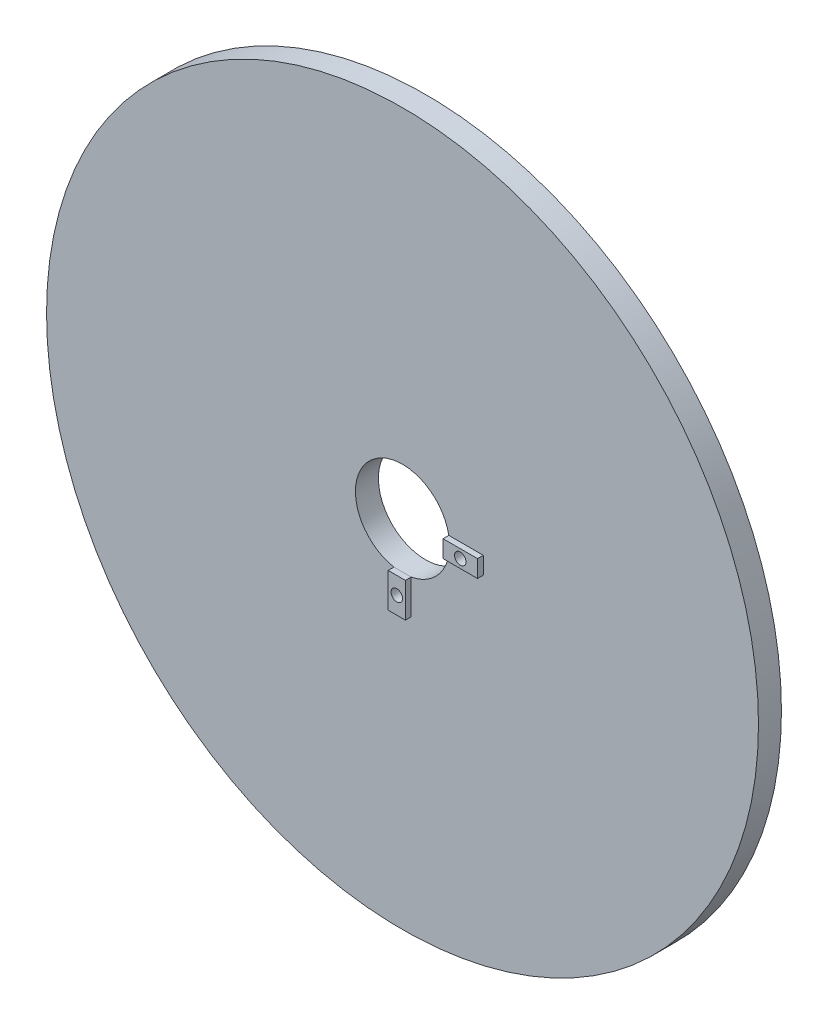
ISO-10303-21;
HEADER;
FILE_DESCRIPTION(('STEP AP214'),'2;1');
FILE_NAME('part.step','',(''),(''),'','','');
FILE_SCHEMA(('AUTOMOTIVE_DESIGN { 1 0 10303 214 1 1 1 1 }'));
ENDSEC;
DATA;
#1=APPLICATION_CONTEXT('core data for automotive mechanical design processes');
#2=APPLICATION_PROTOCOL_DEFINITION('international standard','automotive_design',2000,#1);
#3=PRODUCT_CONTEXT('',#1,'mechanical');
#4=PRODUCT('Part','Part','',(#3));
#5=PRODUCT_RELATED_PRODUCT_CATEGORY('part','',(#4));
#6=PRODUCT_DEFINITION_FORMATION('','',#4);
#7=PRODUCT_DEFINITION_CONTEXT('part definition',#1,'design');
#8=PRODUCT_DEFINITION('design','',#6,#7);
#9=PRODUCT_DEFINITION_SHAPE('','',#8);
#10=(LENGTH_UNIT() NAMED_UNIT(*) SI_UNIT(.MILLI.,.METRE.));
#11=(NAMED_UNIT(*) PLANE_ANGLE_UNIT() SI_UNIT($,.RADIAN.));
#12=(NAMED_UNIT(*) SI_UNIT($,.STERADIAN.) SOLID_ANGLE_UNIT());
#13=UNCERTAINTY_MEASURE_WITH_UNIT(LENGTH_MEASURE(1.E-05),#10,'distance_accuracy_value','');
#14=(GEOMETRIC_REPRESENTATION_CONTEXT(3) GLOBAL_UNCERTAINTY_ASSIGNED_CONTEXT((#13)) GLOBAL_UNIT_ASSIGNED_CONTEXT((#10,
#11,#12)) REPRESENTATION_CONTEXT('',''));
#15=CARTESIAN_POINT('',(0.,0.,0.));
#16=DIRECTION('',(0.,0.,1.));
#17=DIRECTION('',(1.,0.,0.));
#18=AXIS2_PLACEMENT_3D('',#15,#16,#17);
#19=CARTESIAN_POINT('',(0.,0.,3.));
#20=DIRECTION('',(0.,0.,1.));
#21=DIRECTION('',(1.,0.,0.));
#22=AXIS2_PLACEMENT_3D('',#19,#20,#21);
#23=PLANE('',#22);
#24=DIRECTION('',(1.,0.,0.));
#25=VECTOR('',#24,1.);
#26=CARTESIAN_POINT('',(-0.375,-3.51540938769273,3.));
#27=LINE('',#26,#25);
#28=CARTESIAN_POINT('',(-0.375,-3.51540938769273,3.));
#29=VERTEX_POINT('',#28);
#30=CARTESIAN_POINT('',(0.375,-3.51540938769273,3.));
#31=VERTEX_POINT('',#30);
#32=EDGE_CURVE('E189',#29,#31,#27,.T.);
#33=ORIENTED_EDGE('',*,*,#32,.F.);
#34=DIRECTION('',(0.,-1.,0.));
#35=VECTOR('',#34,1.);
#36=CARTESIAN_POINT('',(-0.375,-2.01540938769273,3.));
#37=LINE('',#36,#35);
#38=CARTESIAN_POINT('',(-0.375,-2.01540938769273,3.));
#39=VERTEX_POINT('',#38);
#40=EDGE_CURVE('E121',#39,#29,#37,.T.);
#41=ORIENTED_EDGE('',*,*,#40,.F.);
#42=CARTESIAN_POINT('',(0.,0.,3.));
#43=DIRECTION('',(0.,0.,1.));
#44=DIRECTION('',(1.,0.,0.));
#45=AXIS2_PLACEMENT_3D('',#42,#43,#44);
#46=CIRCLE('',#45,2.05);
#47=CARTESIAN_POINT('',(2.01540938769273,0.375,3.));
#48=VERTEX_POINT('',#47);
#49=EDGE_CURVE('E162',#48,#39,#46,.T.);
#50=ORIENTED_EDGE('',*,*,#49,.F.);
#51=DIRECTION('',(-1.,0.,0.));
#52=VECTOR('',#51,1.);
#53=CARTESIAN_POINT('',(2.01540938769273,0.375,3.));
#54=LINE('',#53,#52);
#55=CARTESIAN_POINT('',(3.51540938769273,0.375,3.));
#56=VERTEX_POINT('',#55);
#57=EDGE_CURVE('E54',#56,#48,#54,.T.);
#58=ORIENTED_EDGE('',*,*,#57,.F.);
#59=DIRECTION('',(0.,1.,0.));
#60=VECTOR('',#59,1.);
#61=CARTESIAN_POINT('',(3.51540938769273,-0.375,3.));
#62=LINE('',#61,#60);
#63=CARTESIAN_POINT('',(3.51540938769273,-0.375,3.));
#64=VERTEX_POINT('',#63);
#65=EDGE_CURVE('E147',#64,#56,#62,.T.);
#66=ORIENTED_EDGE('',*,*,#65,.F.);
#67=DIRECTION('',(1.,0.,0.));
#68=VECTOR('',#67,1.);
#69=CARTESIAN_POINT('',(2.01540938769273,-0.375,3.));
#70=LINE('',#69,#68);
#71=CARTESIAN_POINT('',(2.01540938769273,-0.375,3.));
#72=VERTEX_POINT('',#71);
#73=EDGE_CURVE('E144',#72,#64,#70,.T.);
#74=ORIENTED_EDGE('',*,*,#73,.F.);
#75=CARTESIAN_POINT('',(0.375,-2.01540938769273,3.));
#76=VERTEX_POINT('',#75);
#77=EDGE_CURVE('E166',#76,#72,#46,.T.);
#78=ORIENTED_EDGE('',*,*,#77,.F.);
#79=DIRECTION('',(0.,1.,0.));
#80=VECTOR('',#79,1.);
#81=CARTESIAN_POINT('',(0.375,-2.01540938769273,3.));
#82=LINE('',#81,#80);
#83=EDGE_CURVE('E184',#31,#76,#82,.T.);
#84=ORIENTED_EDGE('',*,*,#83,.F.);
#85=EDGE_LOOP('',(#33,#41,#50,#58,#66,#74,#78,#84));
#86=FACE_BOUND('',#85,.T.);
#87=CARTESIAN_POINT('',(0.,0.,3.));
#88=DIRECTION('',(0.,0.,1.));
#89=DIRECTION('',(1.,0.,0.));
#90=AXIS2_PLACEMENT_3D('',#87,#88,#89);
#91=CIRCLE('',#90,15.5);
#92=CARTESIAN_POINT('',(15.5,0.,3.));
#93=VERTEX_POINT('',#92);
#94=EDGE_CURVE('E11',#93,#93,#91,.T.);
#95=ORIENTED_EDGE('',*,*,#94,.T.);
#96=EDGE_LOOP('',(#95));
#97=FACE_BOUND('',#96,.T.);
#98=ADVANCED_FACE('F32',(#86,#97),#23,.T.);
#99=CARTESIAN_POINT('',(0.,0.,2.));
#100=DIRECTION('',(0.,0.,1.));
#101=DIRECTION('',(1.,0.,0.));
#102=AXIS2_PLACEMENT_3D('',#99,#100,#101);
#103=PLANE('',#102);
#104=CARTESIAN_POINT('',(0.,-2.76540938769273,2.));
#105=DIRECTION('',(0.,0.,1.));
#106=DIRECTION('',(1.,0.,0.));
#107=AXIS2_PLACEMENT_3D('',#104,#105,#106);
#108=CIRCLE('',#107,0.25);
#109=CARTESIAN_POINT('',(0.25,-2.76540938769273,2.));
#110=VERTEX_POINT('',#109);
#111=EDGE_CURVE('E194',#110,#110,#108,.T.);
#112=ORIENTED_EDGE('',*,*,#111,.T.);
#113=EDGE_LOOP('',(#112));
#114=FACE_BOUND('',#113,.T.);
#115=CARTESIAN_POINT('',(2.76540938769273,0.,2.));
#116=DIRECTION('',(0.,0.,1.));
#117=DIRECTION('',(1.,0.,0.));
#118=AXIS2_PLACEMENT_3D('',#115,#116,#117);
#119=CIRCLE('',#118,0.25);
#120=CARTESIAN_POINT('',(3.01540938769273,0.,2.));
#121=VERTEX_POINT('',#120);
#122=EDGE_CURVE('E232',#121,#121,#119,.T.);
#123=ORIENTED_EDGE('',*,*,#122,.T.);
#124=EDGE_LOOP('',(#123));
#125=FACE_BOUND('',#124,.T.);
#126=CARTESIAN_POINT('',(0.,0.,2.));
#127=DIRECTION('',(0.,0.,1.));
#128=DIRECTION('',(1.,0.,0.));
#129=AXIS2_PLACEMENT_3D('',#126,#127,#128);
#130=CIRCLE('',#129,15.5);
#131=CARTESIAN_POINT('',(15.5,0.,2.));
#132=VERTEX_POINT('',#131);
#133=EDGE_CURVE('E36',#132,#132,#130,.T.);
#134=ORIENTED_EDGE('',*,*,#133,.F.);
#135=EDGE_LOOP('',(#134));
#136=FACE_BOUND('',#135,.T.);
#137=CARTESIAN_POINT('',(0.,0.,2.));
#138=DIRECTION('',(0.,0.,1.));
#139=DIRECTION('',(1.,0.,0.));
#140=AXIS2_PLACEMENT_3D('',#137,#138,#139);
#141=CIRCLE('',#140,2.05);
#142=CARTESIAN_POINT('',(2.05,0.,2.));
#143=VERTEX_POINT('',#142);
#144=EDGE_CURVE('E161',#143,#143,#141,.T.);
#145=ORIENTED_EDGE('',*,*,#144,.T.);
#146=EDGE_LOOP('',(#145));
#147=FACE_BOUND('',#146,.T.);
#148=ADVANCED_FACE('F239',(#114,#125,#136,#147),#103,.F.);
#149=CARTESIAN_POINT('',(0.,0.,3.));
#150=DIRECTION('',(0.,0.,-1.));
#151=DIRECTION('',(-1.,0.,0.));
#152=AXIS2_PLACEMENT_3D('',#149,#150,#151);
#153=CYLINDRICAL_SURFACE('',#152,15.5);
#154=ORIENTED_EDGE('',*,*,#94,.F.);
#155=EDGE_LOOP('',(#154));
#156=FACE_BOUND('',#155,.T.);
#157=ORIENTED_EDGE('',*,*,#133,.T.);
#158=EDGE_LOOP('',(#157));
#159=FACE_BOUND('',#158,.T.);
#160=ADVANCED_FACE('F34',(#156,#159),#153,.T.);
#161=CARTESIAN_POINT('',(0.,0.,3.));
#162=DIRECTION('',(0.,0.,-1.));
#163=DIRECTION('',(-1.,0.,0.));
#164=AXIS2_PLACEMENT_3D('',#161,#162,#163);
#165=CYLINDRICAL_SURFACE('',#164,2.05);
#166=ORIENTED_EDGE('',*,*,#49,.T.);
#167=EDGE_CURVE('E165',#39,#76,#46,.T.);
#168=ORIENTED_EDGE('',*,*,#167,.T.);
#169=ORIENTED_EDGE('',*,*,#77,.T.);
#170=EDGE_CURVE('E167',#72,#48,#46,.T.);
#171=ORIENTED_EDGE('',*,*,#170,.T.);
#172=EDGE_LOOP('',(#166,#168,#169,#171));
#173=FACE_BOUND('',#172,.T.);
#174=ORIENTED_EDGE('',*,*,#144,.F.);
#175=EDGE_LOOP('',(#174));
#176=FACE_BOUND('',#175,.T.);
#177=ADVANCED_FACE('F174',(#173,#176),#165,.F.);
#178=CARTESIAN_POINT('',(0.,0.,3.));
#179=DIRECTION('',(0.,0.,-1.));
#180=DIRECTION('',(-1.,0.,0.));
#181=AXIS2_PLACEMENT_3D('',#178,#179,#180);
#182=PLANE('',#181);
#183=ORIENTED_EDGE('',*,*,#170,.F.);
#184=DIRECTION('',(0.,-1.,0.));
#185=VECTOR('',#184,1.);
#186=CARTESIAN_POINT('',(2.01540938769273,-0.375,3.));
#187=LINE('',#186,#185);
#188=EDGE_CURVE('E126',#48,#72,#187,.T.);
#189=ORIENTED_EDGE('',*,*,#188,.F.);
#190=EDGE_LOOP('',(#183,#189));
#191=FACE_BOUND('',#190,.T.);
#192=ADVANCED_FACE('F205',(#191),#182,.T.);
#193=CARTESIAN_POINT('',(0.,0.,3.25));
#194=DIRECTION('',(0.,0.,-1.));
#195=DIRECTION('',(-1.,0.,0.));
#196=AXIS2_PLACEMENT_3D('',#193,#194,#195);
#197=PLANE('',#196);
#198=DIRECTION('',(0.,-1.,0.));
#199=VECTOR('',#198,1.);
#200=CARTESIAN_POINT('',(2.01540938769273,-0.375,3.25));
#201=LINE('',#200,#199);
#202=CARTESIAN_POINT('',(2.01540938769273,0.375,3.25));
#203=VERTEX_POINT('',#202);
#204=CARTESIAN_POINT('',(2.01540938769273,-0.375,3.25));
#205=VERTEX_POINT('',#204);
#206=EDGE_CURVE('E132',#203,#205,#201,.T.);
#207=ORIENTED_EDGE('',*,*,#206,.T.);
#208=DIRECTION('',(1.,0.,0.));
#209=VECTOR('',#208,1.);
#210=CARTESIAN_POINT('',(2.01540938769273,-0.375,3.25));
#211=LINE('',#210,#209);
#212=CARTESIAN_POINT('',(3.51540938769273,-0.375,3.25));
#213=VERTEX_POINT('',#212);
#214=EDGE_CURVE('E135',#205,#213,#211,.T.);
#215=ORIENTED_EDGE('',*,*,#214,.T.);
#216=DIRECTION('',(0.,1.,0.));
#217=VECTOR('',#216,1.);
#218=CARTESIAN_POINT('',(3.51540938769273,-0.375,3.25));
#219=LINE('',#218,#217);
#220=CARTESIAN_POINT('',(3.51540938769273,0.375,3.25));
#221=VERTEX_POINT('',#220);
#222=EDGE_CURVE('E137',#213,#221,#219,.T.);
#223=ORIENTED_EDGE('',*,*,#222,.T.);
#224=DIRECTION('',(-1.,0.,0.));
#225=VECTOR('',#224,1.);
#226=CARTESIAN_POINT('',(2.01540938769273,0.375,3.25));
#227=LINE('',#226,#225);
#228=EDGE_CURVE('E139',#221,#203,#227,.T.);
#229=ORIENTED_EDGE('',*,*,#228,.T.);
#230=EDGE_LOOP('',(#207,#215,#223,#229));
#231=FACE_BOUND('',#230,.T.);
#232=CARTESIAN_POINT('',(2.76540938769273,0.,3.25));
#233=DIRECTION('',(0.,0.,1.));
#234=DIRECTION('',(1.,0.,0.));
#235=AXIS2_PLACEMENT_3D('',#232,#233,#234);
#236=CIRCLE('',#235,0.25);
#237=CARTESIAN_POINT('',(3.01540938769273,0.,3.25));
#238=VERTEX_POINT('',#237);
#239=EDGE_CURVE('E123',#238,#238,#236,.T.);
#240=ORIENTED_EDGE('',*,*,#239,.F.);
#241=EDGE_LOOP('',(#240));
#242=FACE_BOUND('',#241,.T.);
#243=ADVANCED_FACE('F220',(#231,#242),#197,.F.);
#244=CARTESIAN_POINT('',(2.01540938769273,-0.375,3.25));
#245=DIRECTION('',(1.,0.,0.));
#246=DIRECTION('',(0.,0.,-1.));
#247=AXIS2_PLACEMENT_3D('',#244,#245,#246);
#248=PLANE('',#247);
#249=ORIENTED_EDGE('',*,*,#188,.T.);
#250=DIRECTION('',(0.,0.,-1.));
#251=VECTOR('',#250,1.);
#252=CARTESIAN_POINT('',(2.01540938769273,-0.375,3.25));
#253=LINE('',#252,#251);
#254=EDGE_CURVE('E158',#205,#72,#253,.T.);
#255=ORIENTED_EDGE('',*,*,#254,.F.);
#256=ORIENTED_EDGE('',*,*,#206,.F.);
#257=DIRECTION('',(0.,0.,-1.));
#258=VECTOR('',#257,1.);
#259=CARTESIAN_POINT('',(2.01540938769273,0.375,3.25));
#260=LINE('',#259,#258);
#261=EDGE_CURVE('E141',#203,#48,#260,.T.);
#262=ORIENTED_EDGE('',*,*,#261,.T.);
#263=EDGE_LOOP('',(#249,#255,#256,#262));
#264=FACE_BOUND('',#263,.T.);
#265=ADVANCED_FACE('F210',(#264),#248,.F.);
#266=CARTESIAN_POINT('',(2.01540938769273,-0.375,3.25));
#267=DIRECTION('',(0.,1.,0.));
#268=DIRECTION('',(0.,0.,1.));
#269=AXIS2_PLACEMENT_3D('',#266,#267,#268);
#270=PLANE('',#269);
#271=ORIENTED_EDGE('',*,*,#73,.T.);
#272=DIRECTION('',(0.,0.,-1.));
#273=VECTOR('',#272,1.);
#274=CARTESIAN_POINT('',(3.51540938769273,-0.375,3.25));
#275=LINE('',#274,#273);
#276=EDGE_CURVE('E155',#213,#64,#275,.T.);
#277=ORIENTED_EDGE('',*,*,#276,.F.);
#278=ORIENTED_EDGE('',*,*,#214,.F.);
#279=ORIENTED_EDGE('',*,*,#254,.T.);
#280=EDGE_LOOP('',(#271,#277,#278,#279));
#281=FACE_BOUND('',#280,.T.);
#282=ADVANCED_FACE('F207',(#281),#270,.F.);
#283=CARTESIAN_POINT('',(3.51540938769273,-0.375,3.25));
#284=DIRECTION('',(-1.,0.,0.));
#285=DIRECTION('',(0.,0.,1.));
#286=AXIS2_PLACEMENT_3D('',#283,#284,#285);
#287=PLANE('',#286);
#288=ORIENTED_EDGE('',*,*,#65,.T.);
#289=DIRECTION('',(0.,0.,-1.));
#290=VECTOR('',#289,1.);
#291=CARTESIAN_POINT('',(3.51540938769273,0.375,3.25));
#292=LINE('',#291,#290);
#293=EDGE_CURVE('E152',#221,#56,#292,.T.);
#294=ORIENTED_EDGE('',*,*,#293,.F.);
#295=ORIENTED_EDGE('',*,*,#222,.F.);
#296=ORIENTED_EDGE('',*,*,#276,.T.);
#297=EDGE_LOOP('',(#288,#294,#295,#296));
#298=FACE_BOUND('',#297,.T.);
#299=ADVANCED_FACE('F218',(#298),#287,.F.);
#300=CARTESIAN_POINT('',(2.01540938769273,0.375,3.25));
#301=DIRECTION('',(0.,-1.,0.));
#302=DIRECTION('',(0.,0.,-1.));
#303=AXIS2_PLACEMENT_3D('',#300,#301,#302);
#304=PLANE('',#303);
#305=ORIENTED_EDGE('',*,*,#57,.T.);
#306=ORIENTED_EDGE('',*,*,#261,.F.);
#307=ORIENTED_EDGE('',*,*,#228,.F.);
#308=ORIENTED_EDGE('',*,*,#293,.T.);
#309=EDGE_LOOP('',(#305,#306,#307,#308));
#310=FACE_BOUND('',#309,.T.);
#311=ADVANCED_FACE('F214',(#310),#304,.F.);
#312=CARTESIAN_POINT('',(2.76540938769273,0.,3.25));
#313=DIRECTION('',(0.,0.,-1.));
#314=DIRECTION('',(-1.,0.,0.));
#315=AXIS2_PLACEMENT_3D('',#312,#313,#314);
#316=CYLINDRICAL_SURFACE('',#315,0.25);
#317=ORIENTED_EDGE('',*,*,#239,.T.);
#318=EDGE_LOOP('',(#317));
#319=FACE_BOUND('',#318,.T.);
#320=ORIENTED_EDGE('',*,*,#122,.F.);
#321=EDGE_LOOP('',(#320));
#322=FACE_BOUND('',#321,.T.);
#323=ADVANCED_FACE('F226',(#319,#322),#316,.F.);
#324=CARTESIAN_POINT('',(0.,0.,3.));
#325=DIRECTION('',(0.,0.,1.));
#326=DIRECTION('',(1.,0.,0.));
#327=AXIS2_PLACEMENT_3D('',#324,#325,#326);
#328=PLANE('',#327);
#329=ORIENTED_EDGE('',*,*,#167,.F.);
#330=DIRECTION('',(-1.,0.,0.));
#331=VECTOR('',#330,1.);
#332=CARTESIAN_POINT('',(-0.375,-2.01540938769273,3.));
#333=LINE('',#332,#331);
#334=EDGE_CURVE('E46',#76,#39,#333,.T.);
#335=ORIENTED_EDGE('',*,*,#334,.F.);
#336=EDGE_LOOP('',(#329,#335));
#337=FACE_BOUND('',#336,.T.);
#338=ADVANCED_FACE('F178',(#337),#328,.F.);
#339=CARTESIAN_POINT('',(0.,0.,3.25));
#340=DIRECTION('',(0.,0.,1.));
#341=DIRECTION('',(1.,0.,0.));
#342=AXIS2_PLACEMENT_3D('',#339,#340,#341);
#343=PLANE('',#342);
#344=DIRECTION('',(0.,-1.,0.));
#345=VECTOR('',#344,1.);
#346=CARTESIAN_POINT('',(-0.375,-2.01540938769273,3.25));
#347=LINE('',#346,#345);
#348=CARTESIAN_POINT('',(-0.375,-2.01540938769273,3.25));
#349=VERTEX_POINT('',#348);
#350=CARTESIAN_POINT('',(-0.375,-3.51540938769273,3.25));
#351=VERTEX_POINT('',#350);
#352=EDGE_CURVE('E108',#349,#351,#347,.T.);
#353=ORIENTED_EDGE('',*,*,#352,.T.);
#354=DIRECTION('',(1.,0.,0.));
#355=VECTOR('',#354,1.);
#356=CARTESIAN_POINT('',(-0.375,-3.51540938769273,3.25));
#357=LINE('',#356,#355);
#358=CARTESIAN_POINT('',(0.375,-3.51540938769273,3.25));
#359=VERTEX_POINT('',#358);
#360=EDGE_CURVE('E97',#351,#359,#357,.T.);
#361=ORIENTED_EDGE('',*,*,#360,.T.);
#362=DIRECTION('',(0.,1.,0.));
#363=VECTOR('',#362,1.);
#364=CARTESIAN_POINT('',(0.375,-2.01540938769273,3.25));
#365=LINE('',#364,#363);
#366=CARTESIAN_POINT('',(0.375,-2.01540938769273,3.25));
#367=VERTEX_POINT('',#366);
#368=EDGE_CURVE('E107',#359,#367,#365,.T.);
#369=ORIENTED_EDGE('',*,*,#368,.T.);
#370=DIRECTION('',(-1.,0.,0.));
#371=VECTOR('',#370,1.);
#372=CARTESIAN_POINT('',(-0.375,-2.01540938769273,3.25));
#373=LINE('',#372,#371);
#374=EDGE_CURVE('E114',#367,#349,#373,.T.);
#375=ORIENTED_EDGE('',*,*,#374,.T.);
#376=EDGE_LOOP('',(#353,#361,#369,#375));
#377=FACE_BOUND('',#376,.T.);
#378=CARTESIAN_POINT('',(0.,-2.76540938769273,3.25));
#379=DIRECTION('',(0.,0.,1.));
#380=DIRECTION('',(1.,0.,0.));
#381=AXIS2_PLACEMENT_3D('',#378,#379,#380);
#382=CIRCLE('',#381,0.25);
#383=CARTESIAN_POINT('',(0.25,-2.76540938769273,3.25));
#384=VERTEX_POINT('',#383);
#385=EDGE_CURVE('E190',#384,#384,#382,.T.);
#386=ORIENTED_EDGE('',*,*,#385,.F.);
#387=EDGE_LOOP('',(#386));
#388=FACE_BOUND('',#387,.T.);
#389=ADVANCED_FACE('F111',(#377,#388),#343,.T.);
#390=CARTESIAN_POINT('',(-0.375,-2.01540938769273,3.25));
#391=DIRECTION('',(1.,0.,0.));
#392=DIRECTION('',(0.,1.,0.));
#393=AXIS2_PLACEMENT_3D('',#390,#391,#392);
#394=PLANE('',#393);
#395=ORIENTED_EDGE('',*,*,#40,.T.);
#396=DIRECTION('',(0.,0.,-1.));
#397=VECTOR('',#396,1.);
#398=CARTESIAN_POINT('',(-0.375,-3.51540938769273,3.25));
#399=LINE('',#398,#397);
#400=EDGE_CURVE('E101',#351,#29,#399,.T.);
#401=ORIENTED_EDGE('',*,*,#400,.F.);
#402=ORIENTED_EDGE('',*,*,#352,.F.);
#403=DIRECTION('',(0.,0.,-1.));
#404=VECTOR('',#403,1.);
#405=CARTESIAN_POINT('',(-0.375,-2.01540938769273,3.25));
#406=LINE('',#405,#404);
#407=EDGE_CURVE('E181',#349,#39,#406,.T.);
#408=ORIENTED_EDGE('',*,*,#407,.T.);
#409=EDGE_LOOP('',(#395,#401,#402,#408));
#410=FACE_BOUND('',#409,.T.);
#411=ADVANCED_FACE('F119',(#410),#394,.F.);
#412=CARTESIAN_POINT('',(-0.375,-3.51540938769273,3.25));
#413=DIRECTION('',(0.,1.,0.));
#414=DIRECTION('',(0.,0.,1.));
#415=AXIS2_PLACEMENT_3D('',#412,#413,#414);
#416=PLANE('',#415);
#417=ORIENTED_EDGE('',*,*,#32,.T.);
#418=DIRECTION('',(0.,0.,-1.));
#419=VECTOR('',#418,1.);
#420=CARTESIAN_POINT('',(0.375,-3.51540938769273,3.25));
#421=LINE('',#420,#419);
#422=EDGE_CURVE('E104',#359,#31,#421,.T.);
#423=ORIENTED_EDGE('',*,*,#422,.F.);
#424=ORIENTED_EDGE('',*,*,#360,.F.);
#425=ORIENTED_EDGE('',*,*,#400,.T.);
#426=EDGE_LOOP('',(#417,#423,#424,#425));
#427=FACE_BOUND('',#426,.T.);
#428=ADVANCED_FACE('F99',(#427),#416,.F.);
#429=CARTESIAN_POINT('',(0.375,-2.01540938769273,3.25));
#430=DIRECTION('',(-1.,0.,0.));
#431=DIRECTION('',(0.,-1.,0.));
#432=AXIS2_PLACEMENT_3D('',#429,#430,#431);
#433=PLANE('',#432);
#434=ORIENTED_EDGE('',*,*,#83,.T.);
#435=DIRECTION('',(0.,0.,-1.));
#436=VECTOR('',#435,1.);
#437=CARTESIAN_POINT('',(0.375,-2.01540938769273,3.25));
#438=LINE('',#437,#436);
#439=EDGE_CURVE('E128',#367,#76,#438,.T.);
#440=ORIENTED_EDGE('',*,*,#439,.F.);
#441=ORIENTED_EDGE('',*,*,#368,.F.);
#442=ORIENTED_EDGE('',*,*,#422,.T.);
#443=EDGE_LOOP('',(#434,#440,#441,#442));
#444=FACE_BOUND('',#443,.T.);
#445=ADVANCED_FACE('F200',(#444),#433,.F.);
#446=CARTESIAN_POINT('',(-0.375,-2.01540938769273,3.25));
#447=DIRECTION('',(0.,-1.,0.));
#448=DIRECTION('',(0.,0.,-1.));
#449=AXIS2_PLACEMENT_3D('',#446,#447,#448);
#450=PLANE('',#449);
#451=ORIENTED_EDGE('',*,*,#334,.T.);
#452=ORIENTED_EDGE('',*,*,#407,.F.);
#453=ORIENTED_EDGE('',*,*,#374,.F.);
#454=ORIENTED_EDGE('',*,*,#439,.T.);
#455=EDGE_LOOP('',(#451,#452,#453,#454));
#456=FACE_BOUND('',#455,.T.);
#457=ADVANCED_FACE('F180',(#456),#450,.F.);
#458=CARTESIAN_POINT('',(0.,-2.76540938769273,3.25));
#459=DIRECTION('',(0.,0.,-1.));
#460=DIRECTION('',(-1.,0.,0.));
#461=AXIS2_PLACEMENT_3D('',#458,#459,#460);
#462=CYLINDRICAL_SURFACE('',#461,0.25);
#463=ORIENTED_EDGE('',*,*,#385,.T.);
#464=EDGE_LOOP('',(#463));
#465=FACE_BOUND('',#464,.T.);
#466=ORIENTED_EDGE('',*,*,#111,.F.);
#467=EDGE_LOOP('',(#466));
#468=FACE_BOUND('',#467,.T.);
#469=ADVANCED_FACE('F241',(#465,#468),#462,.F.);
#470=CLOSED_SHELL('',(#98,#148,#160,#177,#192,#243,#265,#282,#299,#311,#323,#338,#389,#411,#428,
#445,#457,#469));
#471=MANIFOLD_SOLID_BREP('B2',#470);
#472=ADVANCED_BREP_SHAPE_REPRESENTATION('',(#18,#471),#14);
#473=SHAPE_DEFINITION_REPRESENTATION(#9,#472);
ENDSEC;
END-ISO-10303-21;
